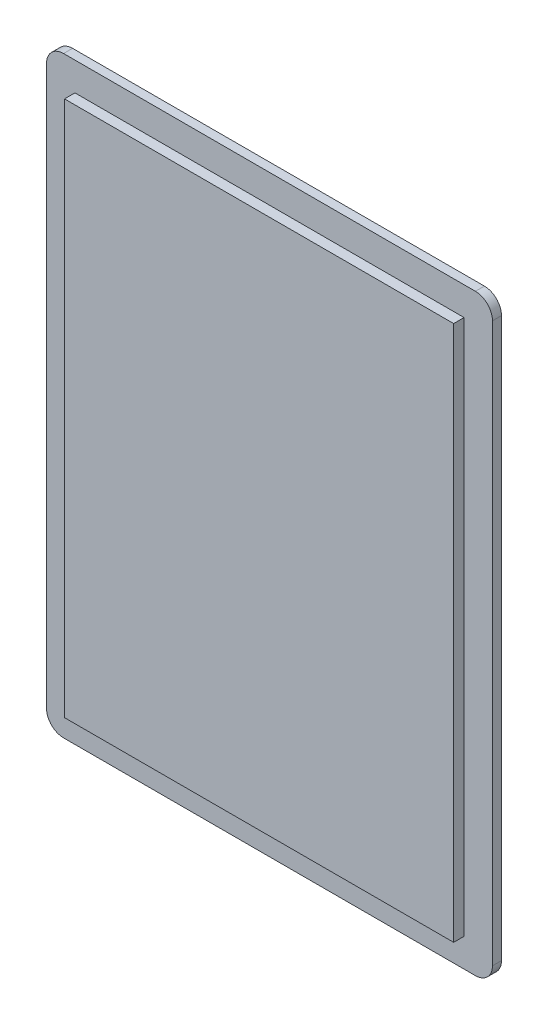
ISO-10303-21;
HEADER;
FILE_DESCRIPTION(('STEP AP214'),'2;1');
FILE_NAME('part.step','',(''),(''),'','','');
FILE_SCHEMA(('AUTOMOTIVE_DESIGN { 1 0 10303 214 1 1 1 1 }'));
ENDSEC;
DATA;
#1=APPLICATION_CONTEXT('core data for automotive mechanical design processes');
#2=APPLICATION_PROTOCOL_DEFINITION('international standard','automotive_design',2000,#1);
#3=PRODUCT_CONTEXT('',#1,'mechanical');
#4=PRODUCT('Part','Part','',(#3));
#5=PRODUCT_RELATED_PRODUCT_CATEGORY('part','',(#4));
#6=PRODUCT_DEFINITION_FORMATION('','',#4);
#7=PRODUCT_DEFINITION_CONTEXT('part definition',#1,'design');
#8=PRODUCT_DEFINITION('design','',#6,#7);
#9=PRODUCT_DEFINITION_SHAPE('','',#8);
#10=(LENGTH_UNIT() NAMED_UNIT(*) SI_UNIT(.MILLI.,.METRE.));
#11=(NAMED_UNIT(*) PLANE_ANGLE_UNIT() SI_UNIT($,.RADIAN.));
#12=(NAMED_UNIT(*) SI_UNIT($,.STERADIAN.) SOLID_ANGLE_UNIT());
#13=UNCERTAINTY_MEASURE_WITH_UNIT(LENGTH_MEASURE(1.E-05),#10,'distance_accuracy_value','');
#14=(GEOMETRIC_REPRESENTATION_CONTEXT(3) GLOBAL_UNCERTAINTY_ASSIGNED_CONTEXT((#13)) GLOBAL_UNIT_ASSIGNED_CONTEXT((#10,
#11,#12)) REPRESENTATION_CONTEXT('',''));
#15=CARTESIAN_POINT('',(0.,0.,0.));
#16=DIRECTION('',(0.,0.,1.));
#17=DIRECTION('',(1.,0.,0.));
#18=AXIS2_PLACEMENT_3D('',#15,#16,#17);
#19=CARTESIAN_POINT('',(0.,0.,4.75));
#20=DIRECTION('',(0.,0.,-1.));
#21=DIRECTION('',(-1.,0.,0.));
#22=AXIS2_PLACEMENT_3D('',#19,#20,#21);
#23=PLANE('',#22);
#24=DIRECTION('',(0.,-1.,0.));
#25=VECTOR('',#24,1.);
#26=CARTESIAN_POINT('',(-235.5,-313.,4.75));
#27=LINE('',#26,#25);
#28=CARTESIAN_POINT('',(-235.5,295.,4.75));
#29=VERTEX_POINT('',#28);
#30=CARTESIAN_POINT('',(-235.5,-295.,4.75));
#31=VERTEX_POINT('',#30);
#32=EDGE_CURVE('E161',#29,#31,#27,.T.);
#33=ORIENTED_EDGE('',*,*,#32,.T.);
#34=CARTESIAN_POINT('',(-217.5,-295.,4.75));
#35=DIRECTION('',(0.,0.,-1.));
#36=DIRECTION('',(-1.,0.,0.));
#37=AXIS2_PLACEMENT_3D('',#34,#35,#36);
#38=CIRCLE('',#37,18.);
#39=CARTESIAN_POINT('',(-217.5,-313.,4.75));
#40=VERTEX_POINT('',#39);
#41=EDGE_CURVE('E198',#31,#40,#38,.F.);
#42=ORIENTED_EDGE('',*,*,#41,.T.);
#43=DIRECTION('',(1.,0.,0.));
#44=VECTOR('',#43,1.);
#45=CARTESIAN_POINT('',(-235.5,-313.,4.75));
#46=LINE('',#45,#44);
#47=CARTESIAN_POINT('',(217.5,-313.,4.75));
#48=VERTEX_POINT('',#47);
#49=EDGE_CURVE('E164',#40,#48,#46,.T.);
#50=ORIENTED_EDGE('',*,*,#49,.T.);
#51=CARTESIAN_POINT('',(217.5,-295.,4.75));
#52=DIRECTION('',(0.,0.,-1.));
#53=DIRECTION('',(-1.,0.,0.));
#54=AXIS2_PLACEMENT_3D('',#51,#52,#53);
#55=CIRCLE('',#54,18.);
#56=CARTESIAN_POINT('',(235.5,-295.,4.75));
#57=VERTEX_POINT('',#56);
#58=EDGE_CURVE('E196',#48,#57,#55,.F.);
#59=ORIENTED_EDGE('',*,*,#58,.T.);
#60=DIRECTION('',(0.,1.,0.));
#61=VECTOR('',#60,1.);
#62=CARTESIAN_POINT('',(235.5,-313.,4.75));
#63=LINE('',#62,#61);
#64=CARTESIAN_POINT('',(235.5,295.,4.75));
#65=VERTEX_POINT('',#64);
#66=EDGE_CURVE('E154',#57,#65,#63,.T.);
#67=ORIENTED_EDGE('',*,*,#66,.T.);
#68=CARTESIAN_POINT('',(217.5,295.,4.75));
#69=DIRECTION('',(0.,0.,-1.));
#70=DIRECTION('',(-1.,0.,0.));
#71=AXIS2_PLACEMENT_3D('',#68,#69,#70);
#72=CIRCLE('',#71,18.);
#73=CARTESIAN_POINT('',(217.5,313.,4.75));
#74=VERTEX_POINT('',#73);
#75=EDGE_CURVE('E194',#65,#74,#72,.F.);
#76=ORIENTED_EDGE('',*,*,#75,.T.);
#77=DIRECTION('',(-1.,0.,0.));
#78=VECTOR('',#77,1.);
#79=CARTESIAN_POINT('',(-235.5,313.,4.75));
#80=LINE('',#79,#78);
#81=CARTESIAN_POINT('',(-217.5,313.,4.75));
#82=VERTEX_POINT('',#81);
#83=EDGE_CURVE('E157',#74,#82,#80,.T.);
#84=ORIENTED_EDGE('',*,*,#83,.T.);
#85=CARTESIAN_POINT('',(-217.5,295.,4.75));
#86=DIRECTION('',(0.,0.,-1.));
#87=DIRECTION('',(-1.,0.,0.));
#88=AXIS2_PLACEMENT_3D('',#85,#86,#87);
#89=CIRCLE('',#88,18.);
#90=EDGE_CURVE('E192',#82,#29,#89,.F.);
#91=ORIENTED_EDGE('',*,*,#90,.T.);
#92=EDGE_LOOP('',(#33,#42,#50,#59,#67,#76,#84,#91));
#93=FACE_BOUND('',#92,.T.);
#94=DIRECTION('',(-1.,0.,0.));
#95=VECTOR('',#94,1.);
#96=CARTESIAN_POINT('',(205.5,283.,4.75));
#97=LINE('',#96,#95);
#98=CARTESIAN_POINT('',(205.5,283.,4.75));
#99=VERTEX_POINT('',#98);
#100=CARTESIAN_POINT('',(-205.5,283.,4.75));
#101=VERTEX_POINT('',#100);
#102=EDGE_CURVE('E51',#99,#101,#97,.T.);
#103=ORIENTED_EDGE('',*,*,#102,.F.);
#104=DIRECTION('',(0.,1.,0.));
#105=VECTOR('',#104,1.);
#106=CARTESIAN_POINT('',(205.5,-283.,4.75));
#107=LINE('',#106,#105);
#108=CARTESIAN_POINT('',(205.5,-283.,4.75));
#109=VERTEX_POINT('',#108);
#110=EDGE_CURVE('E55',#109,#99,#107,.T.);
#111=ORIENTED_EDGE('',*,*,#110,.F.);
#112=DIRECTION('',(1.,0.,0.));
#113=VECTOR('',#112,1.);
#114=CARTESIAN_POINT('',(-205.5,-283.,4.75));
#115=LINE('',#114,#113);
#116=CARTESIAN_POINT('',(-205.5,-283.,4.75));
#117=VERTEX_POINT('',#116);
#118=EDGE_CURVE('E337',#117,#109,#115,.T.);
#119=ORIENTED_EDGE('',*,*,#118,.F.);
#120=DIRECTION('',(0.,-1.,0.));
#121=VECTOR('',#120,1.);
#122=CARTESIAN_POINT('',(-205.5,283.,4.75));
#123=LINE('',#122,#121);
#124=EDGE_CURVE('E343',#101,#117,#123,.T.);
#125=ORIENTED_EDGE('',*,*,#124,.F.);
#126=EDGE_LOOP('',(#103,#111,#119,#125));
#127=FACE_BOUND('',#126,.T.);
#128=ADVANCED_FACE('F36',(#93,#127),#23,.F.);
#129=CARTESIAN_POINT('',(235.5,-313.,4.75));
#130=DIRECTION('',(-1.,0.,0.));
#131=DIRECTION('',(0.,0.,1.));
#132=AXIS2_PLACEMENT_3D('',#129,#130,#131);
#133=PLANE('',#132);
#134=ORIENTED_EDGE('',*,*,#66,.F.);
#135=DIRECTION('',(0.,0.,-1.));
#136=VECTOR('',#135,1.);
#137=CARTESIAN_POINT('',(235.5,-295.,4.75));
#138=LINE('',#137,#136);
#139=CARTESIAN_POINT('',(235.5,-295.,-4.75));
#140=VERTEX_POINT('',#139);
#141=EDGE_CURVE('E202',#57,#140,#138,.T.);
#142=ORIENTED_EDGE('',*,*,#141,.T.);
#143=DIRECTION('',(0.,1.,0.));
#144=VECTOR('',#143,1.);
#145=CARTESIAN_POINT('',(235.5,-313.,-4.75));
#146=LINE('',#145,#144);
#147=CARTESIAN_POINT('',(235.5,295.,-4.75));
#148=VERTEX_POINT('',#147);
#149=EDGE_CURVE('E145',#140,#148,#146,.T.);
#150=ORIENTED_EDGE('',*,*,#149,.T.);
#151=DIRECTION('',(0.,0.,-1.));
#152=VECTOR('',#151,1.);
#153=CARTESIAN_POINT('',(235.5,295.,4.75));
#154=LINE('',#153,#152);
#155=EDGE_CURVE('E200',#148,#65,#154,.F.);
#156=ORIENTED_EDGE('',*,*,#155,.T.);
#157=EDGE_LOOP('',(#134,#142,#150,#156));
#158=FACE_BOUND('',#157,.T.);
#159=ADVANCED_FACE('F238',(#158),#133,.F.);
#160=CARTESIAN_POINT('',(-235.5,313.,4.75));
#161=DIRECTION('',(0.,-1.,0.));
#162=DIRECTION('',(0.,0.,-1.));
#163=AXIS2_PLACEMENT_3D('',#160,#161,#162);
#164=PLANE('',#163);
#165=ORIENTED_EDGE('',*,*,#83,.F.);
#166=DIRECTION('',(0.,0.,-1.));
#167=VECTOR('',#166,1.);
#168=CARTESIAN_POINT('',(217.5,313.,4.75));
#169=LINE('',#168,#167);
#170=CARTESIAN_POINT('',(217.5,313.,-4.75));
#171=VERTEX_POINT('',#170);
#172=EDGE_CURVE('E11',#74,#171,#169,.T.);
#173=ORIENTED_EDGE('',*,*,#172,.T.);
#174=DIRECTION('',(-1.,0.,0.));
#175=VECTOR('',#174,1.);
#176=CARTESIAN_POINT('',(-235.5,313.,-4.75));
#177=LINE('',#176,#175);
#178=CARTESIAN_POINT('',(-217.5,313.,-4.75));
#179=VERTEX_POINT('',#178);
#180=EDGE_CURVE('E148',#171,#179,#177,.T.);
#181=ORIENTED_EDGE('',*,*,#180,.T.);
#182=DIRECTION('',(0.,0.,-1.));
#183=VECTOR('',#182,1.);
#184=CARTESIAN_POINT('',(-217.5,313.,4.75));
#185=LINE('',#184,#183);
#186=EDGE_CURVE('E44',#179,#82,#185,.F.);
#187=ORIENTED_EDGE('',*,*,#186,.T.);
#188=EDGE_LOOP('',(#165,#173,#181,#187));
#189=FACE_BOUND('',#188,.T.);
#190=ADVANCED_FACE('F207',(#189),#164,.F.);
#191=CARTESIAN_POINT('',(-235.5,-313.,4.75));
#192=DIRECTION('',(1.,0.,0.));
#193=DIRECTION('',(0.,0.,-1.));
#194=AXIS2_PLACEMENT_3D('',#191,#192,#193);
#195=PLANE('',#194);
#196=DIRECTION('',(0.,-1.,0.));
#197=VECTOR('',#196,1.);
#198=CARTESIAN_POINT('',(-235.5,-313.,-4.75));
#199=LINE('',#198,#197);
#200=CARTESIAN_POINT('',(-235.5,295.,-4.75));
#201=VERTEX_POINT('',#200);
#202=CARTESIAN_POINT('',(-235.5,-295.,-4.75));
#203=VERTEX_POINT('',#202);
#204=EDGE_CURVE('E170',#201,#203,#199,.T.);
#205=ORIENTED_EDGE('',*,*,#204,.T.);
#206=DIRECTION('',(0.,0.,-1.));
#207=VECTOR('',#206,1.);
#208=CARTESIAN_POINT('',(-235.5,-295.,4.75));
#209=LINE('',#208,#207);
#210=EDGE_CURVE('E190',#203,#31,#209,.F.);
#211=ORIENTED_EDGE('',*,*,#210,.T.);
#212=ORIENTED_EDGE('',*,*,#32,.F.);
#213=DIRECTION('',(0.,0.,-1.));
#214=VECTOR('',#213,1.);
#215=CARTESIAN_POINT('',(-235.5,295.,4.75));
#216=LINE('',#215,#214);
#217=EDGE_CURVE('E187',#29,#201,#216,.T.);
#218=ORIENTED_EDGE('',*,*,#217,.T.);
#219=EDGE_LOOP('',(#205,#211,#212,#218));
#220=FACE_BOUND('',#219,.T.);
#221=ADVANCED_FACE('F218',(#220),#195,.F.);
#222=CARTESIAN_POINT('',(-235.5,-313.,4.75));
#223=DIRECTION('',(0.,1.,0.));
#224=DIRECTION('',(0.,0.,1.));
#225=AXIS2_PLACEMENT_3D('',#222,#223,#224);
#226=PLANE('',#225);
#227=ORIENTED_EDGE('',*,*,#49,.F.);
#228=DIRECTION('',(0.,0.,-1.));
#229=VECTOR('',#228,1.);
#230=CARTESIAN_POINT('',(-217.5,-313.,4.75));
#231=LINE('',#230,#229);
#232=CARTESIAN_POINT('',(-217.5,-313.,-4.75));
#233=VERTEX_POINT('',#232);
#234=EDGE_CURVE('E176',#40,#233,#231,.T.);
#235=ORIENTED_EDGE('',*,*,#234,.T.);
#236=DIRECTION('',(1.,0.,0.));
#237=VECTOR('',#236,1.);
#238=CARTESIAN_POINT('',(-235.5,-313.,-4.75));
#239=LINE('',#238,#237);
#240=CARTESIAN_POINT('',(217.5,-313.,-4.75));
#241=VERTEX_POINT('',#240);
#242=EDGE_CURVE('E158',#233,#241,#239,.T.);
#243=ORIENTED_EDGE('',*,*,#242,.T.);
#244=DIRECTION('',(0.,0.,-1.));
#245=VECTOR('',#244,1.);
#246=CARTESIAN_POINT('',(217.5,-313.,4.75));
#247=LINE('',#246,#245);
#248=EDGE_CURVE('E166',#241,#48,#247,.F.);
#249=ORIENTED_EDGE('',*,*,#248,.T.);
#250=EDGE_LOOP('',(#227,#235,#243,#249));
#251=FACE_BOUND('',#250,.T.);
#252=ADVANCED_FACE('F229',(#251),#226,.F.);
#253=CARTESIAN_POINT('',(0.,0.,-4.75));
#254=DIRECTION('',(0.,0.,-1.));
#255=DIRECTION('',(-1.,0.,0.));
#256=AXIS2_PLACEMENT_3D('',#253,#254,#255);
#257=PLANE('',#256);
#258=ORIENTED_EDGE('',*,*,#242,.F.);
#259=CARTESIAN_POINT('',(-217.5,-295.,-4.75));
#260=DIRECTION('',(0.,0.,-1.));
#261=DIRECTION('',(-1.,0.,0.));
#262=AXIS2_PLACEMENT_3D('',#259,#260,#261);
#263=CIRCLE('',#262,18.);
#264=EDGE_CURVE('E185',#233,#203,#263,.T.);
#265=ORIENTED_EDGE('',*,*,#264,.T.);
#266=ORIENTED_EDGE('',*,*,#204,.F.);
#267=CARTESIAN_POINT('',(-217.5,295.,-4.75));
#268=DIRECTION('',(0.,0.,-1.));
#269=DIRECTION('',(-1.,0.,0.));
#270=AXIS2_PLACEMENT_3D('',#267,#268,#269);
#271=CIRCLE('',#270,18.);
#272=EDGE_CURVE('E179',#201,#179,#271,.T.);
#273=ORIENTED_EDGE('',*,*,#272,.T.);
#274=ORIENTED_EDGE('',*,*,#180,.F.);
#275=CARTESIAN_POINT('',(217.5,295.,-4.75));
#276=DIRECTION('',(0.,0.,-1.));
#277=DIRECTION('',(-1.,0.,0.));
#278=AXIS2_PLACEMENT_3D('',#275,#276,#277);
#279=CIRCLE('',#278,18.);
#280=EDGE_CURVE('E181',#171,#148,#279,.T.);
#281=ORIENTED_EDGE('',*,*,#280,.T.);
#282=ORIENTED_EDGE('',*,*,#149,.F.);
#283=CARTESIAN_POINT('',(217.5,-295.,-4.75));
#284=DIRECTION('',(0.,0.,-1.));
#285=DIRECTION('',(-1.,0.,0.));
#286=AXIS2_PLACEMENT_3D('',#283,#284,#285);
#287=CIRCLE('',#286,18.);
#288=EDGE_CURVE('E183',#140,#241,#287,.T.);
#289=ORIENTED_EDGE('',*,*,#288,.T.);
#290=EDGE_LOOP('',(#258,#265,#266,#273,#274,#281,#282,#289));
#291=FACE_BOUND('',#290,.T.);
#292=ADVANCED_FACE('F222',(#291),#257,.T.);
#293=CARTESIAN_POINT('',(-217.5,-295.,4.75));
#294=DIRECTION('',(0.,0.,-1.));
#295=DIRECTION('',(-1.,0.,0.));
#296=AXIS2_PLACEMENT_3D('',#293,#294,#295);
#297=CYLINDRICAL_SURFACE('',#296,18.);
#298=ORIENTED_EDGE('',*,*,#41,.F.);
#299=ORIENTED_EDGE('',*,*,#210,.F.);
#300=ORIENTED_EDGE('',*,*,#264,.F.);
#301=ORIENTED_EDGE('',*,*,#234,.F.);
#302=EDGE_LOOP('',(#298,#299,#300,#301));
#303=FACE_BOUND('',#302,.T.);
#304=ADVANCED_FACE('F226',(#303),#297,.T.);
#305=CARTESIAN_POINT('',(217.5,-295.,4.75));
#306=DIRECTION('',(0.,0.,-1.));
#307=DIRECTION('',(-1.,0.,0.));
#308=AXIS2_PLACEMENT_3D('',#305,#306,#307);
#309=CYLINDRICAL_SURFACE('',#308,18.);
#310=ORIENTED_EDGE('',*,*,#58,.F.);
#311=ORIENTED_EDGE('',*,*,#248,.F.);
#312=ORIENTED_EDGE('',*,*,#288,.F.);
#313=ORIENTED_EDGE('',*,*,#141,.F.);
#314=EDGE_LOOP('',(#310,#311,#312,#313));
#315=FACE_BOUND('',#314,.T.);
#316=ADVANCED_FACE('F235',(#315),#309,.T.);
#317=CARTESIAN_POINT('',(217.5,295.,4.75));
#318=DIRECTION('',(0.,0.,-1.));
#319=DIRECTION('',(-1.,0.,0.));
#320=AXIS2_PLACEMENT_3D('',#317,#318,#319);
#321=CYLINDRICAL_SURFACE('',#320,18.);
#322=ORIENTED_EDGE('',*,*,#75,.F.);
#323=ORIENTED_EDGE('',*,*,#155,.F.);
#324=ORIENTED_EDGE('',*,*,#280,.F.);
#325=ORIENTED_EDGE('',*,*,#172,.F.);
#326=EDGE_LOOP('',(#322,#323,#324,#325));
#327=FACE_BOUND('',#326,.T.);
#328=ADVANCED_FACE('F241',(#327),#321,.T.);
#329=CARTESIAN_POINT('',(-217.5,295.,4.75));
#330=DIRECTION('',(0.,0.,-1.));
#331=DIRECTION('',(-1.,0.,0.));
#332=AXIS2_PLACEMENT_3D('',#329,#330,#331);
#333=CYLINDRICAL_SURFACE('',#332,18.);
#334=ORIENTED_EDGE('',*,*,#90,.F.);
#335=ORIENTED_EDGE('',*,*,#186,.F.);
#336=ORIENTED_EDGE('',*,*,#272,.F.);
#337=ORIENTED_EDGE('',*,*,#217,.F.);
#338=EDGE_LOOP('',(#334,#335,#336,#337));
#339=FACE_BOUND('',#338,.T.);
#340=ADVANCED_FACE('F38',(#339),#333,.T.);
#341=CARTESIAN_POINT('',(205.5,283.,15.75));
#342=DIRECTION('',(0.,-1.,0.));
#343=DIRECTION('',(0.,0.,-1.));
#344=AXIS2_PLACEMENT_3D('',#341,#342,#343);
#345=PLANE('',#344);
#346=ORIENTED_EDGE('',*,*,#102,.T.);
#347=DIRECTION('',(0.,0.,-1.));
#348=VECTOR('',#347,1.);
#349=CARTESIAN_POINT('',(-205.5,283.,15.75));
#350=LINE('',#349,#348);
#351=CARTESIAN_POINT('',(-205.5,283.,15.75));
#352=VERTEX_POINT('',#351);
#353=EDGE_CURVE('E128',#352,#101,#350,.T.);
#354=ORIENTED_EDGE('',*,*,#353,.F.);
#355=DIRECTION('',(-1.,0.,0.));
#356=VECTOR('',#355,1.);
#357=CARTESIAN_POINT('',(205.5,283.,15.75));
#358=LINE('',#357,#356);
#359=CARTESIAN_POINT('',(205.5,283.,15.75));
#360=VERTEX_POINT('',#359);
#361=EDGE_CURVE('E134',#360,#352,#358,.T.);
#362=ORIENTED_EDGE('',*,*,#361,.F.);
#363=DIRECTION('',(0.,0.,-1.));
#364=VECTOR('',#363,1.);
#365=CARTESIAN_POINT('',(205.5,283.,15.75));
#366=LINE('',#365,#364);
#367=EDGE_CURVE('E335',#360,#99,#366,.T.);
#368=ORIENTED_EDGE('',*,*,#367,.T.);
#369=EDGE_LOOP('',(#346,#354,#362,#368));
#370=FACE_BOUND('',#369,.T.);
#371=ADVANCED_FACE('F144',(#370),#345,.F.);
#372=CARTESIAN_POINT('',(-205.5,283.,15.75));
#373=DIRECTION('',(1.,0.,0.));
#374=DIRECTION('',(0.,0.,-1.));
#375=AXIS2_PLACEMENT_3D('',#372,#373,#374);
#376=PLANE('',#375);
#377=ORIENTED_EDGE('',*,*,#124,.T.);
#378=DIRECTION('',(0.,0.,-1.));
#379=VECTOR('',#378,1.);
#380=CARTESIAN_POINT('',(-205.5,-283.,15.75));
#381=LINE('',#380,#379);
#382=CARTESIAN_POINT('',(-205.5,-283.,15.75));
#383=VERTEX_POINT('',#382);
#384=EDGE_CURVE('E130',#383,#117,#381,.T.);
#385=ORIENTED_EDGE('',*,*,#384,.F.);
#386=DIRECTION('',(0.,-1.,0.));
#387=VECTOR('',#386,1.);
#388=CARTESIAN_POINT('',(-205.5,283.,15.75));
#389=LINE('',#388,#387);
#390=EDGE_CURVE('E123',#352,#383,#389,.T.);
#391=ORIENTED_EDGE('',*,*,#390,.F.);
#392=ORIENTED_EDGE('',*,*,#353,.T.);
#393=EDGE_LOOP('',(#377,#385,#391,#392));
#394=FACE_BOUND('',#393,.T.);
#395=ADVANCED_FACE('F126',(#394),#376,.F.);
#396=CARTESIAN_POINT('',(-205.5,-283.,15.75));
#397=DIRECTION('',(0.,1.,0.));
#398=DIRECTION('',(0.,0.,1.));
#399=AXIS2_PLACEMENT_3D('',#396,#397,#398);
#400=PLANE('',#399);
#401=ORIENTED_EDGE('',*,*,#118,.T.);
#402=DIRECTION('',(0.,0.,-1.));
#403=VECTOR('',#402,1.);
#404=CARTESIAN_POINT('',(205.5,-283.,15.75));
#405=LINE('',#404,#403);
#406=CARTESIAN_POINT('',(205.5,-283.,15.75));
#407=VERTEX_POINT('',#406);
#408=EDGE_CURVE('E150',#407,#109,#405,.T.);
#409=ORIENTED_EDGE('',*,*,#408,.F.);
#410=DIRECTION('',(1.,0.,0.));
#411=VECTOR('',#410,1.);
#412=CARTESIAN_POINT('',(-205.5,-283.,15.75));
#413=LINE('',#412,#411);
#414=EDGE_CURVE('E133',#383,#407,#413,.T.);
#415=ORIENTED_EDGE('',*,*,#414,.F.);
#416=ORIENTED_EDGE('',*,*,#384,.T.);
#417=EDGE_LOOP('',(#401,#409,#415,#416));
#418=FACE_BOUND('',#417,.T.);
#419=ADVANCED_FACE('F304',(#418),#400,.F.);
#420=CARTESIAN_POINT('',(205.5,-283.,15.75));
#421=DIRECTION('',(-1.,0.,0.));
#422=DIRECTION('',(0.,0.,1.));
#423=AXIS2_PLACEMENT_3D('',#420,#421,#422);
#424=PLANE('',#423);
#425=ORIENTED_EDGE('',*,*,#110,.T.);
#426=ORIENTED_EDGE('',*,*,#367,.F.);
#427=DIRECTION('',(0.,1.,0.));
#428=VECTOR('',#427,1.);
#429=CARTESIAN_POINT('',(205.5,-283.,15.75));
#430=LINE('',#429,#428);
#431=EDGE_CURVE('E139',#407,#360,#430,.T.);
#432=ORIENTED_EDGE('',*,*,#431,.F.);
#433=ORIENTED_EDGE('',*,*,#408,.T.);
#434=EDGE_LOOP('',(#425,#426,#432,#433));
#435=FACE_BOUND('',#434,.T.);
#436=ADVANCED_FACE('F312',(#435),#424,.F.);
#437=CARTESIAN_POINT('',(0.,0.,15.75));
#438=DIRECTION('',(0.,0.,1.));
#439=DIRECTION('',(1.,0.,0.));
#440=AXIS2_PLACEMENT_3D('',#437,#438,#439);
#441=PLANE('',#440);
#442=ORIENTED_EDGE('',*,*,#361,.T.);
#443=ORIENTED_EDGE('',*,*,#390,.T.);
#444=ORIENTED_EDGE('',*,*,#414,.T.);
#445=ORIENTED_EDGE('',*,*,#431,.T.);
#446=EDGE_LOOP('',(#442,#443,#444,#445));
#447=FACE_BOUND('',#446,.T.);
#448=ADVANCED_FACE('F137',(#447),#441,.T.);
#449=CLOSED_SHELL('',(#128,#159,#190,#221,#252,#292,#304,#316,#328,#340,#371,#395,#419,#436,#448));
#450=MANIFOLD_SOLID_BREP('B2',#449);
#451=ADVANCED_BREP_SHAPE_REPRESENTATION('',(#18,#450),#14);
#452=SHAPE_DEFINITION_REPRESENTATION(#9,#451);
ENDSEC;
END-ISO-10303-21;
